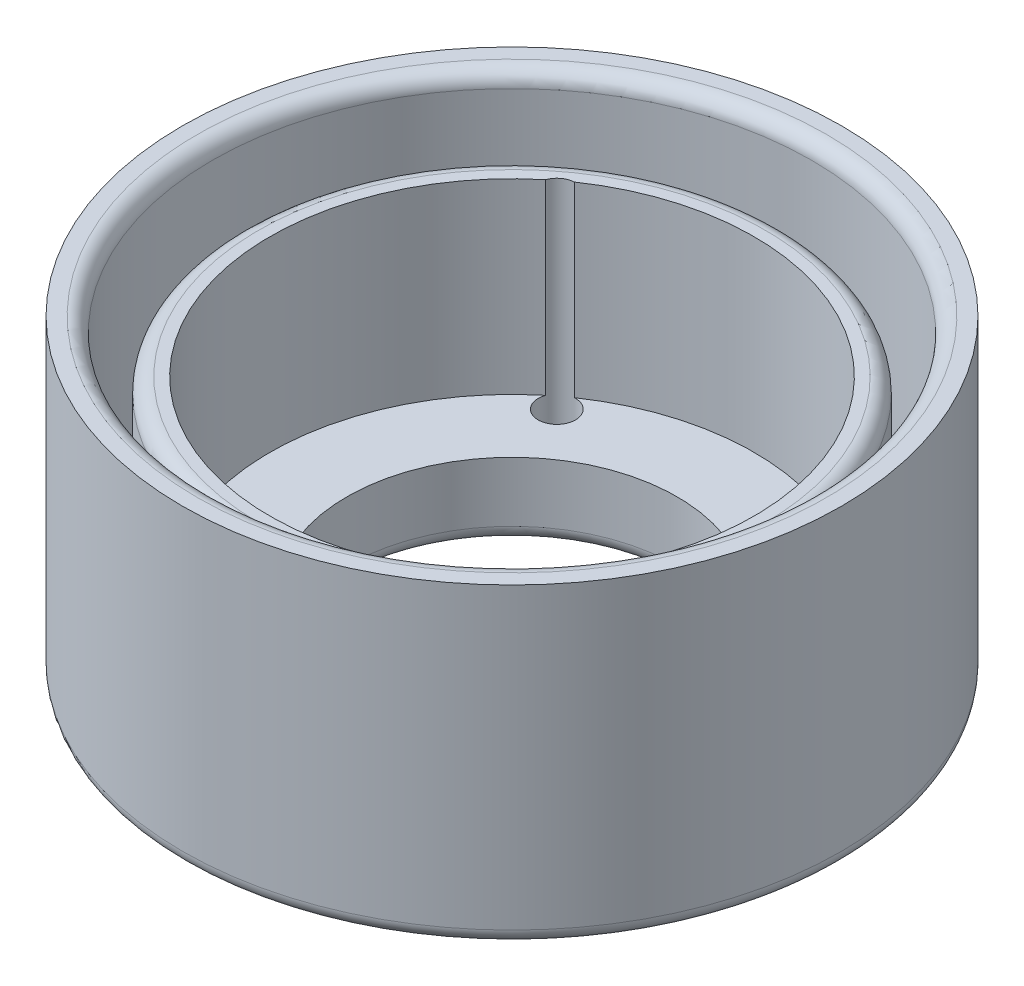
ISO-10303-21;
HEADER;
FILE_DESCRIPTION(('STEP AP214'),'2;1');
FILE_NAME('part.step','',(''),(''),'','','');
FILE_SCHEMA(('AUTOMOTIVE_DESIGN { 1 0 10303 214 1 1 1 1 }'));
ENDSEC;
DATA;
#1=APPLICATION_CONTEXT('core data for automotive mechanical design processes');
#2=APPLICATION_PROTOCOL_DEFINITION('international standard','automotive_design',2000,#1);
#3=PRODUCT_CONTEXT('',#1,'mechanical');
#4=PRODUCT('Part','Part','',(#3));
#5=PRODUCT_RELATED_PRODUCT_CATEGORY('part','',(#4));
#6=PRODUCT_DEFINITION_FORMATION('','',#4);
#7=PRODUCT_DEFINITION_CONTEXT('part definition',#1,'design');
#8=PRODUCT_DEFINITION('design','',#6,#7);
#9=PRODUCT_DEFINITION_SHAPE('','',#8);
#10=(LENGTH_UNIT() NAMED_UNIT(*) SI_UNIT(.MILLI.,.METRE.));
#11=(NAMED_UNIT(*) PLANE_ANGLE_UNIT() SI_UNIT($,.RADIAN.));
#12=(NAMED_UNIT(*) SI_UNIT($,.STERADIAN.) SOLID_ANGLE_UNIT());
#13=UNCERTAINTY_MEASURE_WITH_UNIT(LENGTH_MEASURE(1.E-05),#10,'distance_accuracy_value','');
#14=(GEOMETRIC_REPRESENTATION_CONTEXT(3) GLOBAL_UNCERTAINTY_ASSIGNED_CONTEXT((#13)) GLOBAL_UNIT_ASSIGNED_CONTEXT((#10,
#11,#12)) REPRESENTATION_CONTEXT('',''));
#15=CARTESIAN_POINT('',(0.,0.,0.));
#16=DIRECTION('',(0.,0.,1.));
#17=DIRECTION('',(1.,0.,0.));
#18=AXIS2_PLACEMENT_3D('',#15,#16,#17);
#19=CARTESIAN_POINT('',(-9.1,16.001,-12.1));
#20=DIRECTION('',(0.,-1.,0.));
#21=DIRECTION('',(0.,0.,-1.));
#22=AXIS2_PLACEMENT_3D('',#19,#20,#21);
#23=CYLINDRICAL_SURFACE('',#22,1.25000000000001);
#24=DIRECTION('',(0.,-1.,0.));
#25=VECTOR('',#24,1.);
#26=CARTESIAN_POINT('',(-10.2759858257747,6.25,-12.5237420649132));
#27=LINE('',#26,#25);
#28=CARTESIAN_POINT('',(-10.2759858257747,0.,-12.5237420649132));
#29=VERTEX_POINT('',#28);
#30=CARTESIAN_POINT('',(-10.2759858257747,12.5,-12.5237420649132));
#31=VERTEX_POINT('',#30);
#32=EDGE_CURVE('E52',#29,#31,#27,.F.);
#33=ORIENTED_EDGE('',*,*,#32,.F.);
#34=CARTESIAN_POINT('',(-9.1,0.,-12.1));
#35=DIRECTION('',(0.,1.,0.));
#36=DIRECTION('',(0.,0.,1.));
#37=AXIS2_PLACEMENT_3D('',#34,#35,#36);
#38=CIRCLE('',#37,1.25000000000001);
#39=CARTESIAN_POINT('',(-9.18081222849625,0.,-13.3473850182384));
#40=VERTEX_POINT('',#39);
#41=EDGE_CURVE('E77',#40,#29,#38,.F.);
#42=ORIENTED_EDGE('',*,*,#41,.F.);
#43=DIRECTION('',(0.,-1.,0.));
#44=VECTOR('',#43,1.);
#45=CARTESIAN_POINT('',(-9.18081222849625,6.25,-13.3473850182384));
#46=LINE('',#45,#44);
#47=CARTESIAN_POINT('',(-9.18081222849625,12.5,-13.3473850182384));
#48=VERTEX_POINT('',#47);
#49=EDGE_CURVE('E79',#48,#40,#46,.T.);
#50=ORIENTED_EDGE('',*,*,#49,.F.);
#51=CARTESIAN_POINT('',(-9.1,12.5,-12.1));
#52=DIRECTION('',(0.,1.,0.));
#53=DIRECTION('',(0.,0.,1.));
#54=AXIS2_PLACEMENT_3D('',#51,#52,#53);
#55=CIRCLE('',#54,1.25000000000001);
#56=EDGE_CURVE('E216',#31,#48,#55,.F.);
#57=ORIENTED_EDGE('',*,*,#56,.F.);
#58=EDGE_LOOP('',(#33,#42,#50,#57));
#59=FACE_BOUND('',#58,.T.);
#60=CARTESIAN_POINT('',(-9.1,-2.,-12.1));
#61=DIRECTION('',(0.,-1.,0.));
#62=DIRECTION('',(0.,0.,-1.));
#63=AXIS2_PLACEMENT_3D('',#60,#61,#62);
#64=CIRCLE('',#63,1.25000000000001);
#65=CARTESIAN_POINT('',(-9.1,-2.,-13.35));
#66=VERTEX_POINT('',#65);
#67=EDGE_CURVE('E382',#66,#66,#64,.T.);
#68=ORIENTED_EDGE('',*,*,#67,.T.);
#69=EDGE_LOOP('',(#68));
#70=FACE_BOUND('',#69,.T.);
#71=ADVANCED_FACE('F37',(#59,#70),#23,.F.);
#72=CARTESIAN_POINT('',(9.1,16.001,12.1));
#73=DIRECTION('',(0.,-1.,0.));
#74=DIRECTION('',(0.,0.,-1.));
#75=AXIS2_PLACEMENT_3D('',#72,#73,#74);
#76=CYLINDRICAL_SURFACE('',#75,1.25);
#77=DIRECTION('',(0.,-1.,0.));
#78=VECTOR('',#77,1.);
#79=CARTESIAN_POINT('',(10.2759858257747,6.25,12.5237420649132));
#80=LINE('',#79,#78);
#81=CARTESIAN_POINT('',(10.2759858257747,0.,12.5237420649132));
#82=VERTEX_POINT('',#81);
#83=CARTESIAN_POINT('',(10.2759858257747,12.5,12.5237420649132));
#84=VERTEX_POINT('',#83);
#85=EDGE_CURVE('E222',#82,#84,#80,.F.);
#86=ORIENTED_EDGE('',*,*,#85,.F.);
#87=CARTESIAN_POINT('',(9.1,0.,12.1));
#88=DIRECTION('',(0.,1.,0.));
#89=DIRECTION('',(0.,0.,1.));
#90=AXIS2_PLACEMENT_3D('',#87,#88,#89);
#91=CIRCLE('',#90,1.25);
#92=CARTESIAN_POINT('',(9.18081222849625,0.,13.3473850182384));
#93=VERTEX_POINT('',#92);
#94=EDGE_CURVE('E94',#93,#82,#91,.F.);
#95=ORIENTED_EDGE('',*,*,#94,.F.);
#96=DIRECTION('',(0.,-1.,0.));
#97=VECTOR('',#96,1.);
#98=CARTESIAN_POINT('',(9.18081222849627,6.25,13.3473850182383));
#99=LINE('',#98,#97);
#100=CARTESIAN_POINT('',(9.18081222849625,12.5,13.3473850182384));
#101=VERTEX_POINT('',#100);
#102=EDGE_CURVE('E219',#101,#93,#99,.T.);
#103=ORIENTED_EDGE('',*,*,#102,.F.);
#104=CARTESIAN_POINT('',(9.1,12.5,12.1));
#105=DIRECTION('',(0.,1.,0.));
#106=DIRECTION('',(0.,0.,1.));
#107=AXIS2_PLACEMENT_3D('',#104,#105,#106);
#108=CIRCLE('',#107,1.25);
#109=EDGE_CURVE('E224',#84,#101,#108,.F.);
#110=ORIENTED_EDGE('',*,*,#109,.F.);
#111=EDGE_LOOP('',(#86,#95,#103,#110));
#112=FACE_BOUND('',#111,.T.);
#113=CARTESIAN_POINT('',(9.1,-2.,12.1));
#114=DIRECTION('',(0.,-1.,0.));
#115=DIRECTION('',(0.,0.,-1.));
#116=AXIS2_PLACEMENT_3D('',#113,#114,#115);
#117=CIRCLE('',#116,1.25);
#118=CARTESIAN_POINT('',(9.1,-2.,10.85));
#119=VERTEX_POINT('',#118);
#120=EDGE_CURVE('E207',#119,#119,#117,.T.);
#121=ORIENTED_EDGE('',*,*,#120,.T.);
#122=EDGE_LOOP('',(#121));
#123=FACE_BOUND('',#122,.T.);
#124=ADVANCED_FACE('F136',(#112,#123),#76,.F.);
#125=CARTESIAN_POINT('',(0.,12.5,0.));
#126=DIRECTION('',(0.,-1.,0.));
#127=DIRECTION('',(0.,0.,-1.));
#128=AXIS2_PLACEMENT_3D('',#125,#126,#127);
#129=CYLINDRICAL_SURFACE('',#128,16.2);
#130=ORIENTED_EDGE('',*,*,#49,.T.);
#131=CARTESIAN_POINT('',(0.,0.,0.));
#132=DIRECTION('',(0.,1.,0.));
#133=DIRECTION('',(0.,0.,1.));
#134=AXIS2_PLACEMENT_3D('',#131,#132,#133);
#135=CIRCLE('',#134,16.2);
#136=EDGE_CURVE('E60',#40,#82,#135,.F.);
#137=ORIENTED_EDGE('',*,*,#136,.T.);
#138=ORIENTED_EDGE('',*,*,#85,.T.);
#139=CARTESIAN_POINT('',(0.,12.5,0.));
#140=DIRECTION('',(0.,1.,0.));
#141=DIRECTION('',(0.,0.,1.));
#142=AXIS2_PLACEMENT_3D('',#139,#140,#141);
#143=CIRCLE('',#142,16.2);
#144=EDGE_CURVE('E89',#84,#48,#143,.T.);
#145=ORIENTED_EDGE('',*,*,#144,.T.);
#146=EDGE_LOOP('',(#130,#137,#138,#145));
#147=FACE_BOUND('',#146,.T.);
#148=ADVANCED_FACE('F87',(#147),#129,.F.);
#149=CARTESIAN_POINT('',(0.,16.,0.));
#150=DIRECTION('',(0.,-1.,0.));
#151=DIRECTION('',(0.,0.,-1.));
#152=AXIS2_PLACEMENT_3D('',#149,#150,#151);
#153=CYLINDRICAL_SURFACE('',#152,20.05);
#154=CARTESIAN_POINT('',(0.,15.,0.));
#155=DIRECTION('',(0.,1.,0.));
#156=DIRECTION('',(0.,0.,1.));
#157=AXIS2_PLACEMENT_3D('',#154,#155,#156);
#158=CIRCLE('',#157,20.05);
#159=CARTESIAN_POINT('',(0.,15.,20.05));
#160=VERTEX_POINT('',#159);
#161=EDGE_CURVE('E115',#160,#160,#158,.T.);
#162=ORIENTED_EDGE('',*,*,#161,.T.);
#163=EDGE_LOOP('',(#162));
#164=FACE_BOUND('',#163,.T.);
#165=CARTESIAN_POINT('',(0.,0.,0.));
#166=DIRECTION('',(0.,1.,0.));
#167=DIRECTION('',(0.,0.,1.));
#168=AXIS2_PLACEMENT_3D('',#165,#166,#167);
#169=CIRCLE('',#168,20.05);
#170=CARTESIAN_POINT('',(0.,0.,20.05));
#171=VERTEX_POINT('',#170);
#172=EDGE_CURVE('E100',#171,#171,#169,.T.);
#173=ORIENTED_EDGE('',*,*,#172,.F.);
#174=EDGE_LOOP('',(#173));
#175=FACE_BOUND('',#174,.T.);
#176=ADVANCED_FACE('F176',(#164,#175),#153,.F.);
#177=CARTESIAN_POINT('',(0.,16.,0.));
#178=DIRECTION('',(0.,-1.,0.));
#179=DIRECTION('',(0.,0.,-1.));
#180=AXIS2_PLACEMENT_3D('',#177,#178,#179);
#181=CYLINDRICAL_SURFACE('',#180,22.05);
#182=CARTESIAN_POINT('',(0.,-4.,0.));
#183=DIRECTION('',(0.,1.,0.));
#184=DIRECTION('',(0.,0.,1.));
#185=AXIS2_PLACEMENT_3D('',#182,#183,#184);
#186=CIRCLE('',#185,22.05);
#187=CARTESIAN_POINT('',(0.,-4.,22.05));
#188=VERTEX_POINT('',#187);
#189=EDGE_CURVE('E109',#188,#188,#186,.T.);
#190=ORIENTED_EDGE('',*,*,#189,.T.);
#191=EDGE_LOOP('',(#190));
#192=FACE_BOUND('',#191,.T.);
#193=CARTESIAN_POINT('',(0.,16.,0.));
#194=DIRECTION('',(0.,1.,0.));
#195=DIRECTION('',(0.,0.,1.));
#196=AXIS2_PLACEMENT_3D('',#193,#194,#195);
#197=CIRCLE('',#196,22.05);
#198=CARTESIAN_POINT('',(0.,16.,22.05));
#199=VERTEX_POINT('',#198);
#200=EDGE_CURVE('E96',#199,#199,#197,.T.);
#201=ORIENTED_EDGE('',*,*,#200,.F.);
#202=EDGE_LOOP('',(#201));
#203=FACE_BOUND('',#202,.T.);
#204=ADVANCED_FACE('F172',(#192,#203),#181,.T.);
#205=CARTESIAN_POINT('',(0.,16.,0.));
#206=DIRECTION('',(0.,1.,0.));
#207=DIRECTION('',(0.,0.,1.));
#208=AXIS2_PLACEMENT_3D('',#205,#206,#207);
#209=PLANE('',#208);
#210=CARTESIAN_POINT('',(0.,16.,0.));
#211=DIRECTION('',(0.,1.,0.));
#212=DIRECTION('',(0.,0.,1.));
#213=AXIS2_PLACEMENT_3D('',#210,#211,#212);
#214=CIRCLE('',#213,21.05);
#215=CARTESIAN_POINT('',(0.,16.,21.05));
#216=VERTEX_POINT('',#215);
#217=EDGE_CURVE('E118',#216,#216,#214,.F.);
#218=ORIENTED_EDGE('',*,*,#217,.T.);
#219=EDGE_LOOP('',(#218));
#220=FACE_BOUND('',#219,.T.);
#221=ORIENTED_EDGE('',*,*,#200,.T.);
#222=EDGE_LOOP('',(#221));
#223=FACE_BOUND('',#222,.T.);
#224=ADVANCED_FACE('F165',(#220,#223),#209,.T.);
#225=CARTESIAN_POINT('',(0.,-5.,0.));
#226=DIRECTION('',(0.,1.,0.));
#227=DIRECTION('',(0.,0.,1.));
#228=AXIS2_PLACEMENT_3D('',#225,#226,#227);
#229=PLANE('',#228);
#230=CARTESIAN_POINT('',(0.,-5.,0.));
#231=DIRECTION('',(0.,1.,0.));
#232=DIRECTION('',(0.,0.,1.));
#233=AXIS2_PLACEMENT_3D('',#230,#231,#232);
#234=CIRCLE('',#233,21.05);
#235=CARTESIAN_POINT('',(0.,-5.,21.05));
#236=VERTEX_POINT('',#235);
#237=EDGE_CURVE('E112',#236,#236,#234,.F.);
#238=ORIENTED_EDGE('',*,*,#237,.T.);
#239=EDGE_LOOP('',(#238));
#240=FACE_BOUND('',#239,.T.);
#241=CARTESIAN_POINT('',(0.,-5.,0.));
#242=DIRECTION('',(0.,1.,0.));
#243=DIRECTION('',(0.,0.,1.));
#244=AXIS2_PLACEMENT_3D('',#241,#242,#243);
#245=CIRCLE('',#244,12.05);
#246=CARTESIAN_POINT('',(0.,-5.,12.05));
#247=VERTEX_POINT('',#246);
#248=EDGE_CURVE('E106',#247,#247,#245,.T.);
#249=ORIENTED_EDGE('',*,*,#248,.T.);
#250=EDGE_LOOP('',(#249));
#251=FACE_BOUND('',#250,.T.);
#252=CARTESIAN_POINT('',(-9.1,-5.,-12.1));
#253=DIRECTION('',(0.,-1.,0.));
#254=DIRECTION('',(0.,0.,-1.));
#255=AXIS2_PLACEMENT_3D('',#252,#253,#254);
#256=CIRCLE('',#255,2.5);
#257=CARTESIAN_POINT('',(-9.1,-5.,-14.6));
#258=VERTEX_POINT('',#257);
#259=EDGE_CURVE('E202',#258,#258,#256,.T.);
#260=ORIENTED_EDGE('',*,*,#259,.F.);
#261=EDGE_LOOP('',(#260));
#262=FACE_BOUND('',#261,.T.);
#263=CARTESIAN_POINT('',(9.1,-5.,12.1));
#264=DIRECTION('',(0.,-1.,0.));
#265=DIRECTION('',(0.,0.,-1.));
#266=AXIS2_PLACEMENT_3D('',#263,#264,#265);
#267=CIRCLE('',#266,2.5);
#268=CARTESIAN_POINT('',(9.1,-5.,9.6));
#269=VERTEX_POINT('',#268);
#270=EDGE_CURVE('E205',#269,#269,#267,.T.);
#271=ORIENTED_EDGE('',*,*,#270,.F.);
#272=EDGE_LOOP('',(#271));
#273=FACE_BOUND('',#272,.T.);
#274=ADVANCED_FACE('F162',(#240,#251,#262,#273),#229,.F.);
#275=CARTESIAN_POINT('',(0.,0.,0.));
#276=DIRECTION('',(0.,1.,0.));
#277=DIRECTION('',(0.,0.,1.));
#278=AXIS2_PLACEMENT_3D('',#275,#276,#277);
#279=PLANE('',#278);
#280=CARTESIAN_POINT('',(0.,0.,0.));
#281=DIRECTION('',(0.,1.,0.));
#282=DIRECTION('',(0.,0.,1.));
#283=AXIS2_PLACEMENT_3D('',#280,#281,#282);
#284=CIRCLE('',#283,17.95);
#285=CARTESIAN_POINT('',(0.,0.,17.95));
#286=VERTEX_POINT('',#285);
#287=EDGE_CURVE('E230',#286,#286,#284,.T.);
#288=ORIENTED_EDGE('',*,*,#287,.F.);
#289=EDGE_LOOP('',(#288));
#290=FACE_BOUND('',#289,.T.);
#291=ORIENTED_EDGE('',*,*,#172,.T.);
#292=EDGE_LOOP('',(#291));
#293=FACE_BOUND('',#292,.T.);
#294=ADVANCED_FACE('F160',(#290,#293),#279,.T.);
#295=ORIENTED_EDGE('',*,*,#32,.T.);
#296=EDGE_CURVE('E232',#31,#101,#143,.T.);
#297=ORIENTED_EDGE('',*,*,#296,.T.);
#298=ORIENTED_EDGE('',*,*,#102,.T.);
#299=EDGE_CURVE('E95',#93,#29,#135,.F.);
#300=ORIENTED_EDGE('',*,*,#299,.T.);
#301=EDGE_LOOP('',(#295,#297,#298,#300));
#302=FACE_BOUND('',#301,.T.);
#303=ADVANCED_FACE('F156',(#302),#129,.F.);
#304=CARTESIAN_POINT('',(0.,12.5,0.));
#305=DIRECTION('',(0.,-1.,0.));
#306=DIRECTION('',(0.,0.,-1.));
#307=AXIS2_PLACEMENT_3D('',#304,#305,#306);
#308=CYLINDRICAL_SURFACE('',#307,17.95);
#309=CARTESIAN_POINT('',(0.,11.5,0.));
#310=DIRECTION('',(0.,1.,0.));
#311=DIRECTION('',(0.,0.,1.));
#312=AXIS2_PLACEMENT_3D('',#309,#310,#311);
#313=CIRCLE('',#312,17.95);
#314=CARTESIAN_POINT('',(0.,11.5,17.95));
#315=VERTEX_POINT('',#314);
#316=EDGE_CURVE('E11',#315,#315,#313,.F.);
#317=ORIENTED_EDGE('',*,*,#316,.T.);
#318=EDGE_LOOP('',(#317));
#319=FACE_BOUND('',#318,.T.);
#320=ORIENTED_EDGE('',*,*,#287,.T.);
#321=EDGE_LOOP('',(#320));
#322=FACE_BOUND('',#321,.T.);
#323=ADVANCED_FACE('F153',(#319,#322),#308,.T.);
#324=CARTESIAN_POINT('',(0.,12.5,0.));
#325=DIRECTION('',(0.,1.,0.));
#326=DIRECTION('',(0.,0.,1.));
#327=AXIS2_PLACEMENT_3D('',#324,#325,#326);
#328=PLANE('',#327);
#329=CARTESIAN_POINT('',(0.,12.5,0.));
#330=DIRECTION('',(0.,1.,0.));
#331=DIRECTION('',(0.,0.,1.));
#332=AXIS2_PLACEMENT_3D('',#329,#330,#331);
#333=CIRCLE('',#332,16.95);
#334=CARTESIAN_POINT('',(0.,12.5,16.95));
#335=VERTEX_POINT('',#334);
#336=EDGE_CURVE('E45',#335,#335,#333,.T.);
#337=ORIENTED_EDGE('',*,*,#336,.T.);
#338=EDGE_LOOP('',(#337));
#339=FACE_BOUND('',#338,.T.);
#340=ORIENTED_EDGE('',*,*,#56,.T.);
#341=ORIENTED_EDGE('',*,*,#144,.F.);
#342=ORIENTED_EDGE('',*,*,#109,.T.);
#343=ORIENTED_EDGE('',*,*,#296,.F.);
#344=EDGE_LOOP('',(#340,#341,#342,#343));
#345=FACE_BOUND('',#344,.T.);
#346=ADVANCED_FACE('F123',(#339,#345),#328,.T.);
#347=ORIENTED_EDGE('',*,*,#41,.T.);
#348=ORIENTED_EDGE('',*,*,#299,.F.);
#349=ORIENTED_EDGE('',*,*,#94,.T.);
#350=ORIENTED_EDGE('',*,*,#136,.F.);
#351=EDGE_LOOP('',(#347,#348,#349,#350));
#352=FACE_BOUND('',#351,.T.);
#353=CARTESIAN_POINT('',(0.,0.,0.));
#354=DIRECTION('',(0.,1.,0.));
#355=DIRECTION('',(0.,0.,1.));
#356=AXIS2_PLACEMENT_3D('',#353,#354,#355);
#357=CIRCLE('',#356,11.05);
#358=CARTESIAN_POINT('',(0.,0.,11.05));
#359=VERTEX_POINT('',#358);
#360=EDGE_CURVE('E227',#359,#359,#357,.F.);
#361=ORIENTED_EDGE('',*,*,#360,.T.);
#362=EDGE_LOOP('',(#361));
#363=FACE_BOUND('',#362,.T.);
#364=ADVANCED_FACE('F92',(#352,#363),#279,.T.);
#365=CARTESIAN_POINT('',(0.,16.001,0.));
#366=DIRECTION('',(0.,-1.,0.));
#367=DIRECTION('',(0.,0.,-1.));
#368=AXIS2_PLACEMENT_3D('',#365,#366,#367);
#369=CYLINDRICAL_SURFACE('',#368,11.05);
#370=CARTESIAN_POINT('',(0.,-4.,0.));
#371=DIRECTION('',(0.,1.,0.));
#372=DIRECTION('',(0.,0.,1.));
#373=AXIS2_PLACEMENT_3D('',#370,#371,#372);
#374=CIRCLE('',#373,11.05);
#375=CARTESIAN_POINT('',(0.,-4.,11.05));
#376=VERTEX_POINT('',#375);
#377=EDGE_CURVE('E98',#376,#376,#374,.F.);
#378=ORIENTED_EDGE('',*,*,#377,.T.);
#379=EDGE_LOOP('',(#378));
#380=FACE_BOUND('',#379,.T.);
#381=ORIENTED_EDGE('',*,*,#360,.F.);
#382=EDGE_LOOP('',(#381));
#383=FACE_BOUND('',#382,.T.);
#384=ADVANCED_FACE('F147',(#380,#383),#369,.F.);
#385=CARTESIAN_POINT('',(9.1,-2.,12.1));
#386=DIRECTION('',(0.,-1.,0.));
#387=DIRECTION('',(0.,0.,-1.));
#388=AXIS2_PLACEMENT_3D('',#385,#386,#387);
#389=CYLINDRICAL_SURFACE('',#388,2.5);
#390=CARTESIAN_POINT('',(9.1,-2.,12.1));
#391=DIRECTION('',(0.,-1.,0.));
#392=DIRECTION('',(0.,0.,-1.));
#393=AXIS2_PLACEMENT_3D('',#390,#391,#392);
#394=CIRCLE('',#393,2.5);
#395=CARTESIAN_POINT('',(9.1,-2.,9.6));
#396=VERTEX_POINT('',#395);
#397=EDGE_CURVE('E84',#396,#396,#394,.T.);
#398=ORIENTED_EDGE('',*,*,#397,.F.);
#399=EDGE_LOOP('',(#398));
#400=FACE_BOUND('',#399,.T.);
#401=ORIENTED_EDGE('',*,*,#270,.T.);
#402=EDGE_LOOP('',(#401));
#403=FACE_BOUND('',#402,.T.);
#404=ADVANCED_FACE('F144',(#400,#403),#389,.F.);
#405=CARTESIAN_POINT('',(9.1,-2.,12.1));
#406=DIRECTION('',(0.,-1.,0.));
#407=DIRECTION('',(0.,0.,-1.));
#408=AXIS2_PLACEMENT_3D('',#405,#406,#407);
#409=PLANE('',#408);
#410=ORIENTED_EDGE('',*,*,#120,.F.);
#411=EDGE_LOOP('',(#410));
#412=FACE_BOUND('',#411,.T.);
#413=ORIENTED_EDGE('',*,*,#397,.T.);
#414=EDGE_LOOP('',(#413));
#415=FACE_BOUND('',#414,.T.);
#416=ADVANCED_FACE('F241',(#412,#415),#409,.T.);
#417=CARTESIAN_POINT('',(-9.1,-2.,-12.1));
#418=DIRECTION('',(0.,-1.,0.));
#419=DIRECTION('',(0.,0.,-1.));
#420=AXIS2_PLACEMENT_3D('',#417,#418,#419);
#421=CYLINDRICAL_SURFACE('',#420,2.5);
#422=CARTESIAN_POINT('',(-9.1,-2.,-12.1));
#423=DIRECTION('',(0.,-1.,0.));
#424=DIRECTION('',(0.,0.,-1.));
#425=AXIS2_PLACEMENT_3D('',#422,#423,#424);
#426=CIRCLE('',#425,2.5);
#427=CARTESIAN_POINT('',(-9.1,-2.,-14.6));
#428=VERTEX_POINT('',#427);
#429=EDGE_CURVE('E212',#428,#428,#426,.T.);
#430=ORIENTED_EDGE('',*,*,#429,.F.);
#431=EDGE_LOOP('',(#430));
#432=FACE_BOUND('',#431,.T.);
#433=ORIENTED_EDGE('',*,*,#259,.T.);
#434=EDGE_LOOP('',(#433));
#435=FACE_BOUND('',#434,.T.);
#436=ADVANCED_FACE('F244',(#432,#435),#421,.F.);
#437=CARTESIAN_POINT('',(-9.1,-2.,-12.1));
#438=DIRECTION('',(0.,-1.,0.));
#439=DIRECTION('',(0.,0.,-1.));
#440=AXIS2_PLACEMENT_3D('',#437,#438,#439);
#441=PLANE('',#440);
#442=ORIENTED_EDGE('',*,*,#67,.F.);
#443=EDGE_LOOP('',(#442));
#444=FACE_BOUND('',#443,.T.);
#445=ORIENTED_EDGE('',*,*,#429,.T.);
#446=EDGE_LOOP('',(#445));
#447=FACE_BOUND('',#446,.T.);
#448=ADVANCED_FACE('F184',(#444,#447),#441,.T.);
#449=CARTESIAN_POINT('',(0.,-4.,0.));
#450=DIRECTION('',(0.,1.,0.));
#451=DIRECTION('',(0.,0.,1.));
#452=AXIS2_PLACEMENT_3D('',#449,#450,#451);
#453=TOROIDAL_SURFACE('',#452,12.05,1.);
#454=ORIENTED_EDGE('',*,*,#248,.F.);
#455=EDGE_LOOP('',(#454));
#456=FACE_BOUND('',#455,.T.);
#457=ORIENTED_EDGE('',*,*,#377,.F.);
#458=EDGE_LOOP('',(#457));
#459=FACE_BOUND('',#458,.T.);
#460=ADVANCED_FACE('F181',(#456,#459),#453,.T.);
#461=CARTESIAN_POINT('',(0.,-4.,0.));
#462=DIRECTION('',(0.,1.,0.));
#463=DIRECTION('',(0.,0.,1.));
#464=AXIS2_PLACEMENT_3D('',#461,#462,#463);
#465=TOROIDAL_SURFACE('',#464,21.05,1.);
#466=ORIENTED_EDGE('',*,*,#237,.F.);
#467=EDGE_LOOP('',(#466));
#468=FACE_BOUND('',#467,.T.);
#469=ORIENTED_EDGE('',*,*,#189,.F.);
#470=EDGE_LOOP('',(#469));
#471=FACE_BOUND('',#470,.T.);
#472=ADVANCED_FACE('F132',(#468,#471),#465,.T.);
#473=CARTESIAN_POINT('',(0.,15.,0.));
#474=DIRECTION('',(0.,1.,0.));
#475=DIRECTION('',(0.,0.,1.));
#476=AXIS2_PLACEMENT_3D('',#473,#474,#475);
#477=TOROIDAL_SURFACE('',#476,21.05,1.);
#478=ORIENTED_EDGE('',*,*,#217,.F.);
#479=EDGE_LOOP('',(#478));
#480=FACE_BOUND('',#479,.T.);
#481=ORIENTED_EDGE('',*,*,#161,.F.);
#482=EDGE_LOOP('',(#481));
#483=FACE_BOUND('',#482,.T.);
#484=ADVANCED_FACE('F127',(#480,#483),#477,.T.);
#485=CARTESIAN_POINT('',(0.,11.5,0.));
#486=DIRECTION('',(0.,1.,0.));
#487=DIRECTION('',(0.,0.,1.));
#488=AXIS2_PLACEMENT_3D('',#485,#486,#487);
#489=TOROIDAL_SURFACE('',#488,16.95,1.);
#490=ORIENTED_EDGE('',*,*,#316,.F.);
#491=EDGE_LOOP('',(#490));
#492=FACE_BOUND('',#491,.T.);
#493=ORIENTED_EDGE('',*,*,#336,.F.);
#494=EDGE_LOOP('',(#493));
#495=FACE_BOUND('',#494,.T.);
#496=ADVANCED_FACE('F39',(#492,#495),#489,.T.);
#497=CLOSED_SHELL('',(#71,#124,#148,#176,#204,#224,#274,#294,#303,#323,#346,#364,#384,#404,#416,
#436,#448,#460,#472,#484,#496));
#498=MANIFOLD_SOLID_BREP('B2',#497);
#499=ADVANCED_BREP_SHAPE_REPRESENTATION('',(#18,#498),#14);
#500=SHAPE_DEFINITION_REPRESENTATION(#9,#499);
ENDSEC;
END-ISO-10303-21;
